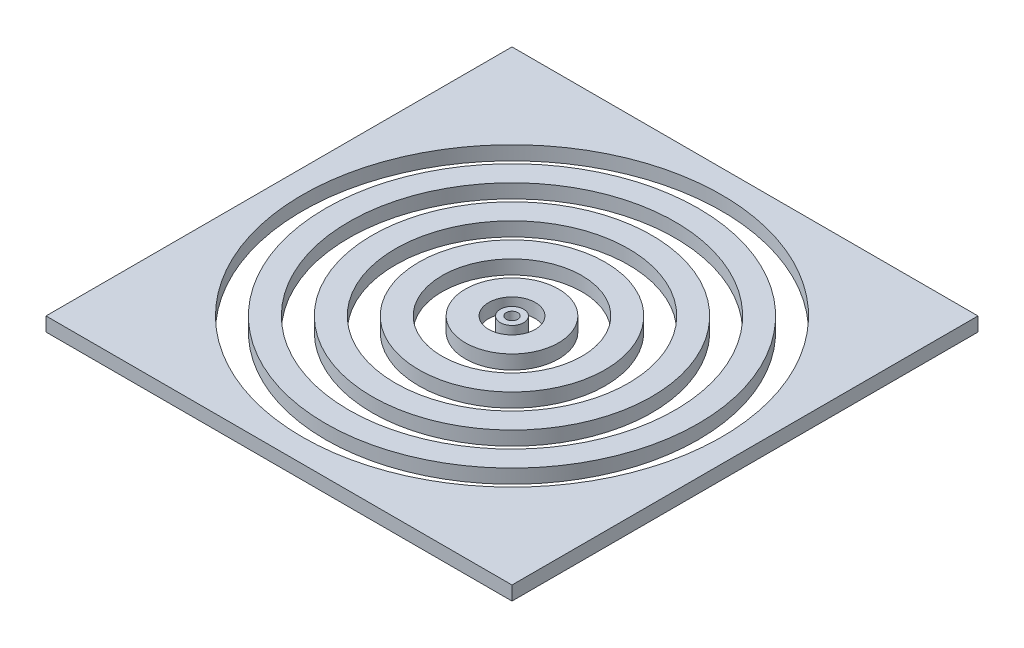
ISO-10303-21;
HEADER;
FILE_DESCRIPTION(('STEP AP214'),'2;1');
FILE_NAME('part.step','',(''),(''),'','','');
FILE_SCHEMA(('AUTOMOTIVE_DESIGN { 1 0 10303 214 1 1 1 1 }'));
ENDSEC;
DATA;
#1=APPLICATION_CONTEXT('core data for automotive mechanical design processes');
#2=APPLICATION_PROTOCOL_DEFINITION('international standard','automotive_design',2000,#1);
#3=PRODUCT_CONTEXT('',#1,'mechanical');
#4=PRODUCT('Part','Part','',(#3));
#5=PRODUCT_RELATED_PRODUCT_CATEGORY('part','',(#4));
#6=PRODUCT_DEFINITION_FORMATION('','',#4);
#7=PRODUCT_DEFINITION_CONTEXT('part definition',#1,'design');
#8=PRODUCT_DEFINITION('design','',#6,#7);
#9=PRODUCT_DEFINITION_SHAPE('','',#8);
#10=(LENGTH_UNIT() NAMED_UNIT(*) SI_UNIT(.MILLI.,.METRE.));
#11=(NAMED_UNIT(*) PLANE_ANGLE_UNIT() SI_UNIT($,.RADIAN.));
#12=(NAMED_UNIT(*) SI_UNIT($,.STERADIAN.) SOLID_ANGLE_UNIT());
#13=UNCERTAINTY_MEASURE_WITH_UNIT(LENGTH_MEASURE(1.E-05),#10,'distance_accuracy_value','');
#14=(GEOMETRIC_REPRESENTATION_CONTEXT(3) GLOBAL_UNCERTAINTY_ASSIGNED_CONTEXT((#13)) GLOBAL_UNIT_ASSIGNED_CONTEXT((#10,
#11,#12)) REPRESENTATION_CONTEXT('',''));
#15=CARTESIAN_POINT('',(0.,0.,0.));
#16=DIRECTION('',(0.,0.,1.));
#17=DIRECTION('',(1.,0.,0.));
#18=AXIS2_PLACEMENT_3D('',#15,#16,#17);
#19=CARTESIAN_POINT('',(50.,0.,-50.));
#20=DIRECTION('',(0.,1.,0.));
#21=DIRECTION('',(0.,0.,1.));
#22=AXIS2_PLACEMENT_3D('',#19,#20,#21);
#23=CYLINDRICAL_SURFACE('',#22,2.5);
#24=CARTESIAN_POINT('',(50.,0.,-50.));
#25=DIRECTION('',(0.,1.,0.));
#26=DIRECTION('',(0.,0.,1.));
#27=AXIS2_PLACEMENT_3D('',#24,#25,#26);
#28=CIRCLE('',#27,2.5);
#29=CARTESIAN_POINT('',(50.,0.,-47.5));
#30=VERTEX_POINT('',#29);
#31=EDGE_CURVE('E11',#30,#30,#28,.T.);
#32=ORIENTED_EDGE('',*,*,#31,.T.);
#33=EDGE_LOOP('',(#32));
#34=FACE_BOUND('',#33,.T.);
#35=CARTESIAN_POINT('',(50.,3.,-50.));
#36=DIRECTION('',(0.,1.,0.));
#37=DIRECTION('',(0.,0.,1.));
#38=AXIS2_PLACEMENT_3D('',#35,#36,#37);
#39=CIRCLE('',#38,2.5);
#40=CARTESIAN_POINT('',(50.,3.,-47.5));
#41=VERTEX_POINT('',#40);
#42=EDGE_CURVE('E42',#41,#41,#39,.T.);
#43=ORIENTED_EDGE('',*,*,#42,.F.);
#44=EDGE_LOOP('',(#43));
#45=FACE_BOUND('',#44,.T.);
#46=ADVANCED_FACE('F39',(#34,#45),#23,.T.);
#47=CARTESIAN_POINT('',(50.,0.,-50.));
#48=DIRECTION('',(0.,1.,0.));
#49=DIRECTION('',(0.,0.,1.));
#50=AXIS2_PLACEMENT_3D('',#47,#48,#49);
#51=PLANE('',#50);
#52=CARTESIAN_POINT('',(50.,0.,-50.));
#53=DIRECTION('',(0.,1.,0.));
#54=DIRECTION('',(0.,0.,1.));
#55=AXIS2_PLACEMENT_3D('',#52,#53,#54);
#56=CIRCLE('',#55,1.25);
#57=CARTESIAN_POINT('',(50.,0.,-48.75));
#58=VERTEX_POINT('',#57);
#59=EDGE_CURVE('E49',#58,#58,#56,.T.);
#60=ORIENTED_EDGE('',*,*,#59,.T.);
#61=EDGE_LOOP('',(#60));
#62=FACE_BOUND('',#61,.T.);
#63=ORIENTED_EDGE('',*,*,#31,.F.);
#64=EDGE_LOOP('',(#63));
#65=FACE_BOUND('',#64,.T.);
#66=ADVANCED_FACE('F57',(#62,#65),#51,.F.);
#67=CARTESIAN_POINT('',(50.,3.,-50.));
#68=DIRECTION('',(0.,1.,0.));
#69=DIRECTION('',(0.,0.,1.));
#70=AXIS2_PLACEMENT_3D('',#67,#68,#69);
#71=PLANE('',#70);
#72=CARTESIAN_POINT('',(50.,3.,-50.));
#73=DIRECTION('',(0.,1.,0.));
#74=DIRECTION('',(0.,0.,1.));
#75=AXIS2_PLACEMENT_3D('',#72,#73,#74);
#76=CIRCLE('',#75,1.25);
#77=CARTESIAN_POINT('',(50.,3.,-48.75));
#78=VERTEX_POINT('',#77);
#79=EDGE_CURVE('E51',#78,#78,#76,.T.);
#80=ORIENTED_EDGE('',*,*,#79,.F.);
#81=EDGE_LOOP('',(#80));
#82=FACE_BOUND('',#81,.T.);
#83=ORIENTED_EDGE('',*,*,#42,.T.);
#84=EDGE_LOOP('',(#83));
#85=FACE_BOUND('',#84,.T.);
#86=ADVANCED_FACE('F63',(#82,#85),#71,.T.);
#87=CARTESIAN_POINT('',(50.,0.,-50.));
#88=DIRECTION('',(0.,1.,0.));
#89=DIRECTION('',(0.,0.,1.));
#90=AXIS2_PLACEMENT_3D('',#87,#88,#89);
#91=CYLINDRICAL_SURFACE('',#90,1.25);
#92=ORIENTED_EDGE('',*,*,#59,.F.);
#93=EDGE_LOOP('',(#92));
#94=FACE_BOUND('',#93,.T.);
#95=ORIENTED_EDGE('',*,*,#79,.T.);
#96=EDGE_LOOP('',(#95));
#97=FACE_BOUND('',#96,.T.);
#98=ADVANCED_FACE('F60',(#94,#97),#91,.F.);
#99=CLOSED_SHELL('',(#46,#66,#86,#98));
#100=MANIFOLD_SOLID_BREP('B2',#99);
#101=CARTESIAN_POINT('',(50.,0.,-50.));
#102=DIRECTION('',(0.,1.,0.));
#103=DIRECTION('',(0.,0.,1.));
#104=AXIS2_PLACEMENT_3D('',#101,#102,#103);
#105=CYLINDRICAL_SURFACE('',#104,10.);
#106=CARTESIAN_POINT('',(50.,0.,-50.));
#107=DIRECTION('',(0.,1.,0.));
#108=DIRECTION('',(0.,0.,1.));
#109=AXIS2_PLACEMENT_3D('',#106,#107,#108);
#110=CIRCLE('',#109,10.);
#111=CARTESIAN_POINT('',(50.,0.,-40.));
#112=VERTEX_POINT('',#111);
#113=EDGE_CURVE('E38',#112,#112,#110,.T.);
#114=ORIENTED_EDGE('',*,*,#113,.T.);
#115=EDGE_LOOP('',(#114));
#116=FACE_BOUND('',#115,.T.);
#117=CARTESIAN_POINT('',(50.,3.,-50.));
#118=DIRECTION('',(0.,1.,0.));
#119=DIRECTION('',(0.,0.,1.));
#120=AXIS2_PLACEMENT_3D('',#117,#118,#119);
#121=CIRCLE('',#120,10.);
#122=CARTESIAN_POINT('',(50.,3.,-40.));
#123=VERTEX_POINT('',#122);
#124=EDGE_CURVE('E111',#123,#123,#121,.T.);
#125=ORIENTED_EDGE('',*,*,#124,.F.);
#126=EDGE_LOOP('',(#125));
#127=FACE_BOUND('',#126,.T.);
#128=ADVANCED_FACE('F108',(#116,#127),#105,.T.);
#129=CARTESIAN_POINT('',(50.,0.,-50.));
#130=DIRECTION('',(0.,1.,0.));
#131=DIRECTION('',(0.,0.,1.));
#132=AXIS2_PLACEMENT_3D('',#129,#130,#131);
#133=PLANE('',#132);
#134=CARTESIAN_POINT('',(50.,0.,-50.));
#135=DIRECTION('',(0.,1.,0.));
#136=DIRECTION('',(0.,0.,1.));
#137=AXIS2_PLACEMENT_3D('',#134,#135,#136);
#138=CIRCLE('',#137,5.);
#139=CARTESIAN_POINT('',(50.,0.,-45.));
#140=VERTEX_POINT('',#139);
#141=EDGE_CURVE('E118',#140,#140,#138,.T.);
#142=ORIENTED_EDGE('',*,*,#141,.T.);
#143=EDGE_LOOP('',(#142));
#144=FACE_BOUND('',#143,.T.);
#145=ORIENTED_EDGE('',*,*,#113,.F.);
#146=EDGE_LOOP('',(#145));
#147=FACE_BOUND('',#146,.T.);
#148=ADVANCED_FACE('F126',(#144,#147),#133,.F.);
#149=CARTESIAN_POINT('',(50.,3.,-50.));
#150=DIRECTION('',(0.,1.,0.));
#151=DIRECTION('',(0.,0.,1.));
#152=AXIS2_PLACEMENT_3D('',#149,#150,#151);
#153=PLANE('',#152);
#154=CARTESIAN_POINT('',(50.,3.,-50.));
#155=DIRECTION('',(0.,1.,0.));
#156=DIRECTION('',(0.,0.,1.));
#157=AXIS2_PLACEMENT_3D('',#154,#155,#156);
#158=CIRCLE('',#157,5.);
#159=CARTESIAN_POINT('',(50.,3.,-45.));
#160=VERTEX_POINT('',#159);
#161=EDGE_CURVE('E120',#160,#160,#158,.T.);
#162=ORIENTED_EDGE('',*,*,#161,.F.);
#163=EDGE_LOOP('',(#162));
#164=FACE_BOUND('',#163,.T.);
#165=ORIENTED_EDGE('',*,*,#124,.T.);
#166=EDGE_LOOP('',(#165));
#167=FACE_BOUND('',#166,.T.);
#168=ADVANCED_FACE('F132',(#164,#167),#153,.T.);
#169=CARTESIAN_POINT('',(50.,0.,-50.));
#170=DIRECTION('',(0.,1.,0.));
#171=DIRECTION('',(0.,0.,1.));
#172=AXIS2_PLACEMENT_3D('',#169,#170,#171);
#173=CYLINDRICAL_SURFACE('',#172,5.);
#174=ORIENTED_EDGE('',*,*,#141,.F.);
#175=EDGE_LOOP('',(#174));
#176=FACE_BOUND('',#175,.T.);
#177=ORIENTED_EDGE('',*,*,#161,.T.);
#178=EDGE_LOOP('',(#177));
#179=FACE_BOUND('',#178,.T.);
#180=ADVANCED_FACE('F129',(#176,#179),#173,.F.);
#181=CLOSED_SHELL('',(#128,#148,#168,#180));
#182=MANIFOLD_SOLID_BREP('B6',#181);
#183=CARTESIAN_POINT('',(50.,0.,-50.));
#184=DIRECTION('',(0.,1.,0.));
#185=DIRECTION('',(0.,0.,1.));
#186=AXIS2_PLACEMENT_3D('',#183,#184,#185);
#187=CYLINDRICAL_SURFACE('',#186,20.);
#188=CARTESIAN_POINT('',(50.,0.,-50.));
#189=DIRECTION('',(0.,1.,0.));
#190=DIRECTION('',(0.,0.,1.));
#191=AXIS2_PLACEMENT_3D('',#188,#189,#190);
#192=CIRCLE('',#191,20.);
#193=CARTESIAN_POINT('',(50.,0.,-30.));
#194=VERTEX_POINT('',#193);
#195=EDGE_CURVE('E107',#194,#194,#192,.T.);
#196=ORIENTED_EDGE('',*,*,#195,.T.);
#197=EDGE_LOOP('',(#196));
#198=FACE_BOUND('',#197,.T.);
#199=CARTESIAN_POINT('',(50.,3.,-50.));
#200=DIRECTION('',(0.,1.,0.));
#201=DIRECTION('',(0.,0.,1.));
#202=AXIS2_PLACEMENT_3D('',#199,#200,#201);
#203=CIRCLE('',#202,20.);
#204=CARTESIAN_POINT('',(50.,3.,-30.));
#205=VERTEX_POINT('',#204);
#206=EDGE_CURVE('E180',#205,#205,#203,.T.);
#207=ORIENTED_EDGE('',*,*,#206,.F.);
#208=EDGE_LOOP('',(#207));
#209=FACE_BOUND('',#208,.T.);
#210=ADVANCED_FACE('F177',(#198,#209),#187,.T.);
#211=CARTESIAN_POINT('',(50.,0.,-50.));
#212=DIRECTION('',(0.,1.,0.));
#213=DIRECTION('',(0.,0.,1.));
#214=AXIS2_PLACEMENT_3D('',#211,#212,#213);
#215=PLANE('',#214);
#216=CARTESIAN_POINT('',(50.,0.,-50.));
#217=DIRECTION('',(0.,1.,0.));
#218=DIRECTION('',(0.,0.,1.));
#219=AXIS2_PLACEMENT_3D('',#216,#217,#218);
#220=CIRCLE('',#219,15.);
#221=CARTESIAN_POINT('',(50.,0.,-35.));
#222=VERTEX_POINT('',#221);
#223=EDGE_CURVE('E187',#222,#222,#220,.T.);
#224=ORIENTED_EDGE('',*,*,#223,.T.);
#225=EDGE_LOOP('',(#224));
#226=FACE_BOUND('',#225,.T.);
#227=ORIENTED_EDGE('',*,*,#195,.F.);
#228=EDGE_LOOP('',(#227));
#229=FACE_BOUND('',#228,.T.);
#230=ADVANCED_FACE('F195',(#226,#229),#215,.F.);
#231=CARTESIAN_POINT('',(50.,3.,-50.));
#232=DIRECTION('',(0.,1.,0.));
#233=DIRECTION('',(0.,0.,1.));
#234=AXIS2_PLACEMENT_3D('',#231,#232,#233);
#235=PLANE('',#234);
#236=CARTESIAN_POINT('',(50.,3.,-50.));
#237=DIRECTION('',(0.,1.,0.));
#238=DIRECTION('',(0.,0.,1.));
#239=AXIS2_PLACEMENT_3D('',#236,#237,#238);
#240=CIRCLE('',#239,15.);
#241=CARTESIAN_POINT('',(50.,3.,-35.));
#242=VERTEX_POINT('',#241);
#243=EDGE_CURVE('E189',#242,#242,#240,.T.);
#244=ORIENTED_EDGE('',*,*,#243,.F.);
#245=EDGE_LOOP('',(#244));
#246=FACE_BOUND('',#245,.T.);
#247=ORIENTED_EDGE('',*,*,#206,.T.);
#248=EDGE_LOOP('',(#247));
#249=FACE_BOUND('',#248,.T.);
#250=ADVANCED_FACE('F201',(#246,#249),#235,.T.);
#251=CARTESIAN_POINT('',(50.,0.,-50.));
#252=DIRECTION('',(0.,1.,0.));
#253=DIRECTION('',(0.,0.,1.));
#254=AXIS2_PLACEMENT_3D('',#251,#252,#253);
#255=CYLINDRICAL_SURFACE('',#254,15.);
#256=ORIENTED_EDGE('',*,*,#223,.F.);
#257=EDGE_LOOP('',(#256));
#258=FACE_BOUND('',#257,.T.);
#259=ORIENTED_EDGE('',*,*,#243,.T.);
#260=EDGE_LOOP('',(#259));
#261=FACE_BOUND('',#260,.T.);
#262=ADVANCED_FACE('F198',(#258,#261),#255,.F.);
#263=CLOSED_SHELL('',(#210,#230,#250,#262));
#264=MANIFOLD_SOLID_BREP('B33',#263);
#265=CARTESIAN_POINT('',(50.,0.,-50.));
#266=DIRECTION('',(0.,1.,0.));
#267=DIRECTION('',(0.,0.,1.));
#268=AXIS2_PLACEMENT_3D('',#265,#266,#267);
#269=CYLINDRICAL_SURFACE('',#268,30.);
#270=CARTESIAN_POINT('',(50.,0.,-50.));
#271=DIRECTION('',(0.,1.,0.));
#272=DIRECTION('',(0.,0.,1.));
#273=AXIS2_PLACEMENT_3D('',#270,#271,#272);
#274=CIRCLE('',#273,30.);
#275=CARTESIAN_POINT('',(50.,0.,-20.));
#276=VERTEX_POINT('',#275);
#277=EDGE_CURVE('E176',#276,#276,#274,.T.);
#278=ORIENTED_EDGE('',*,*,#277,.T.);
#279=EDGE_LOOP('',(#278));
#280=FACE_BOUND('',#279,.T.);
#281=CARTESIAN_POINT('',(50.,3.,-50.));
#282=DIRECTION('',(0.,1.,0.));
#283=DIRECTION('',(0.,0.,1.));
#284=AXIS2_PLACEMENT_3D('',#281,#282,#283);
#285=CIRCLE('',#284,30.);
#286=CARTESIAN_POINT('',(50.,3.,-20.));
#287=VERTEX_POINT('',#286);
#288=EDGE_CURVE('E249',#287,#287,#285,.T.);
#289=ORIENTED_EDGE('',*,*,#288,.F.);
#290=EDGE_LOOP('',(#289));
#291=FACE_BOUND('',#290,.T.);
#292=ADVANCED_FACE('F246',(#280,#291),#269,.T.);
#293=CARTESIAN_POINT('',(50.,0.,-50.));
#294=DIRECTION('',(0.,1.,0.));
#295=DIRECTION('',(0.,0.,1.));
#296=AXIS2_PLACEMENT_3D('',#293,#294,#295);
#297=PLANE('',#296);
#298=CARTESIAN_POINT('',(50.,0.,-50.));
#299=DIRECTION('',(0.,1.,0.));
#300=DIRECTION('',(0.,0.,1.));
#301=AXIS2_PLACEMENT_3D('',#298,#299,#300);
#302=CIRCLE('',#301,25.);
#303=CARTESIAN_POINT('',(50.,0.,-25.));
#304=VERTEX_POINT('',#303);
#305=EDGE_CURVE('E256',#304,#304,#302,.T.);
#306=ORIENTED_EDGE('',*,*,#305,.T.);
#307=EDGE_LOOP('',(#306));
#308=FACE_BOUND('',#307,.T.);
#309=ORIENTED_EDGE('',*,*,#277,.F.);
#310=EDGE_LOOP('',(#309));
#311=FACE_BOUND('',#310,.T.);
#312=ADVANCED_FACE('F264',(#308,#311),#297,.F.);
#313=CARTESIAN_POINT('',(50.,3.,-50.));
#314=DIRECTION('',(0.,1.,0.));
#315=DIRECTION('',(0.,0.,1.));
#316=AXIS2_PLACEMENT_3D('',#313,#314,#315);
#317=PLANE('',#316);
#318=CARTESIAN_POINT('',(50.,3.,-50.));
#319=DIRECTION('',(0.,1.,0.));
#320=DIRECTION('',(0.,0.,1.));
#321=AXIS2_PLACEMENT_3D('',#318,#319,#320);
#322=CIRCLE('',#321,25.);
#323=CARTESIAN_POINT('',(50.,3.,-25.));
#324=VERTEX_POINT('',#323);
#325=EDGE_CURVE('E258',#324,#324,#322,.T.);
#326=ORIENTED_EDGE('',*,*,#325,.F.);
#327=EDGE_LOOP('',(#326));
#328=FACE_BOUND('',#327,.T.);
#329=ORIENTED_EDGE('',*,*,#288,.T.);
#330=EDGE_LOOP('',(#329));
#331=FACE_BOUND('',#330,.T.);
#332=ADVANCED_FACE('F270',(#328,#331),#317,.T.);
#333=CARTESIAN_POINT('',(50.,0.,-50.));
#334=DIRECTION('',(0.,1.,0.));
#335=DIRECTION('',(0.,0.,1.));
#336=AXIS2_PLACEMENT_3D('',#333,#334,#335);
#337=CYLINDRICAL_SURFACE('',#336,25.);
#338=ORIENTED_EDGE('',*,*,#305,.F.);
#339=EDGE_LOOP('',(#338));
#340=FACE_BOUND('',#339,.T.);
#341=ORIENTED_EDGE('',*,*,#325,.T.);
#342=EDGE_LOOP('',(#341));
#343=FACE_BOUND('',#342,.T.);
#344=ADVANCED_FACE('F267',(#340,#343),#337,.F.);
#345=CLOSED_SHELL('',(#292,#312,#332,#344));
#346=MANIFOLD_SOLID_BREP('B102',#345);
#347=CARTESIAN_POINT('',(50.,0.,-50.));
#348=DIRECTION('',(0.,1.,0.));
#349=DIRECTION('',(0.,0.,1.));
#350=AXIS2_PLACEMENT_3D('',#347,#348,#349);
#351=CYLINDRICAL_SURFACE('',#350,40.);
#352=CARTESIAN_POINT('',(50.,0.,-50.));
#353=DIRECTION('',(0.,1.,0.));
#354=DIRECTION('',(0.,0.,1.));
#355=AXIS2_PLACEMENT_3D('',#352,#353,#354);
#356=CIRCLE('',#355,40.);
#357=CARTESIAN_POINT('',(50.,0.,-10.));
#358=VERTEX_POINT('',#357);
#359=EDGE_CURVE('E245',#358,#358,#356,.T.);
#360=ORIENTED_EDGE('',*,*,#359,.T.);
#361=EDGE_LOOP('',(#360));
#362=FACE_BOUND('',#361,.T.);
#363=CARTESIAN_POINT('',(50.,3.,-50.));
#364=DIRECTION('',(0.,1.,0.));
#365=DIRECTION('',(0.,0.,1.));
#366=AXIS2_PLACEMENT_3D('',#363,#364,#365);
#367=CIRCLE('',#366,40.);
#368=CARTESIAN_POINT('',(50.,3.,-10.));
#369=VERTEX_POINT('',#368);
#370=EDGE_CURVE('E319',#369,#369,#367,.T.);
#371=ORIENTED_EDGE('',*,*,#370,.F.);
#372=EDGE_LOOP('',(#371));
#373=FACE_BOUND('',#372,.T.);
#374=ADVANCED_FACE('F316',(#362,#373),#351,.T.);
#375=CARTESIAN_POINT('',(50.,0.,-50.));
#376=DIRECTION('',(0.,1.,0.));
#377=DIRECTION('',(0.,0.,1.));
#378=AXIS2_PLACEMENT_3D('',#375,#376,#377);
#379=PLANE('',#378);
#380=CARTESIAN_POINT('',(50.,0.,-50.));
#381=DIRECTION('',(0.,1.,0.));
#382=DIRECTION('',(0.,0.,1.));
#383=AXIS2_PLACEMENT_3D('',#380,#381,#382);
#384=CIRCLE('',#383,35.);
#385=CARTESIAN_POINT('',(50.,0.,-15.));
#386=VERTEX_POINT('',#385);
#387=EDGE_CURVE('E326',#386,#386,#384,.T.);
#388=ORIENTED_EDGE('',*,*,#387,.T.);
#389=EDGE_LOOP('',(#388));
#390=FACE_BOUND('',#389,.T.);
#391=ORIENTED_EDGE('',*,*,#359,.F.);
#392=EDGE_LOOP('',(#391));
#393=FACE_BOUND('',#392,.T.);
#394=ADVANCED_FACE('F334',(#390,#393),#379,.F.);
#395=CARTESIAN_POINT('',(50.,3.,-50.));
#396=DIRECTION('',(0.,1.,0.));
#397=DIRECTION('',(0.,0.,1.));
#398=AXIS2_PLACEMENT_3D('',#395,#396,#397);
#399=PLANE('',#398);
#400=CARTESIAN_POINT('',(50.,3.,-50.));
#401=DIRECTION('',(0.,1.,0.));
#402=DIRECTION('',(0.,0.,1.));
#403=AXIS2_PLACEMENT_3D('',#400,#401,#402);
#404=CIRCLE('',#403,35.);
#405=CARTESIAN_POINT('',(50.,3.,-15.));
#406=VERTEX_POINT('',#405);
#407=EDGE_CURVE('E328',#406,#406,#404,.T.);
#408=ORIENTED_EDGE('',*,*,#407,.F.);
#409=EDGE_LOOP('',(#408));
#410=FACE_BOUND('',#409,.T.);
#411=ORIENTED_EDGE('',*,*,#370,.T.);
#412=EDGE_LOOP('',(#411));
#413=FACE_BOUND('',#412,.T.);
#414=ADVANCED_FACE('F340',(#410,#413),#399,.T.);
#415=CARTESIAN_POINT('',(50.,0.,-50.));
#416=DIRECTION('',(0.,1.,0.));
#417=DIRECTION('',(0.,0.,1.));
#418=AXIS2_PLACEMENT_3D('',#415,#416,#417);
#419=CYLINDRICAL_SURFACE('',#418,35.);
#420=ORIENTED_EDGE('',*,*,#387,.F.);
#421=EDGE_LOOP('',(#420));
#422=FACE_BOUND('',#421,.T.);
#423=ORIENTED_EDGE('',*,*,#407,.T.);
#424=EDGE_LOOP('',(#423));
#425=FACE_BOUND('',#424,.T.);
#426=ADVANCED_FACE('F337',(#422,#425),#419,.F.);
#427=CLOSED_SHELL('',(#374,#394,#414,#426));
#428=MANIFOLD_SOLID_BREP('B171',#427);
#429=CARTESIAN_POINT('',(0.,3.,0.));
#430=DIRECTION('',(1.,0.,0.));
#431=DIRECTION('',(0.,0.,-1.));
#432=AXIS2_PLACEMENT_3D('',#429,#430,#431);
#433=PLANE('',#432);
#434=DIRECTION('',(0.,0.,1.));
#435=VECTOR('',#434,1.);
#436=CARTESIAN_POINT('',(0.,0.,0.));
#437=LINE('',#436,#435);
#438=CARTESIAN_POINT('',(0.,0.,-100.));
#439=VERTEX_POINT('',#438);
#440=CARTESIAN_POINT('',(0.,0.,0.));
#441=VERTEX_POINT('',#440);
#442=EDGE_CURVE('E440',#439,#441,#437,.T.);
#443=ORIENTED_EDGE('',*,*,#442,.T.);
#444=DIRECTION('',(0.,-1.,0.));
#445=VECTOR('',#444,1.);
#446=CARTESIAN_POINT('',(0.,3.,0.));
#447=LINE('',#446,#445);
#448=CARTESIAN_POINT('',(0.,3.,0.));
#449=VERTEX_POINT('',#448);
#450=EDGE_CURVE('E314',#449,#441,#447,.T.);
#451=ORIENTED_EDGE('',*,*,#450,.F.);
#452=DIRECTION('',(0.,0.,1.));
#453=VECTOR('',#452,1.);
#454=CARTESIAN_POINT('',(0.,3.,0.));
#455=LINE('',#454,#453);
#456=CARTESIAN_POINT('',(0.,3.,-100.));
#457=VERTEX_POINT('',#456);
#458=EDGE_CURVE('E428',#457,#449,#455,.T.);
#459=ORIENTED_EDGE('',*,*,#458,.F.);
#460=DIRECTION('',(0.,-1.,0.));
#461=VECTOR('',#460,1.);
#462=CARTESIAN_POINT('',(0.,3.,-100.));
#463=LINE('',#462,#461);
#464=EDGE_CURVE('E436',#457,#439,#463,.T.);
#465=ORIENTED_EDGE('',*,*,#464,.T.);
#466=EDGE_LOOP('',(#443,#451,#459,#465));
#467=FACE_BOUND('',#466,.T.);
#468=ADVANCED_FACE('F377',(#467),#433,.F.);
#469=CARTESIAN_POINT('',(0.,3.,0.));
#470=DIRECTION('',(0.,0.,-1.));
#471=DIRECTION('',(-1.,0.,0.));
#472=AXIS2_PLACEMENT_3D('',#469,#470,#471);
#473=PLANE('',#472);
#474=DIRECTION('',(1.,0.,0.));
#475=VECTOR('',#474,1.);
#476=CARTESIAN_POINT('',(0.,0.,0.));
#477=LINE('',#476,#475);
#478=CARTESIAN_POINT('',(100.,0.,0.));
#479=VERTEX_POINT('',#478);
#480=EDGE_CURVE('E432',#441,#479,#477,.T.);
#481=ORIENTED_EDGE('',*,*,#480,.T.);
#482=DIRECTION('',(0.,-1.,0.));
#483=VECTOR('',#482,1.);
#484=CARTESIAN_POINT('',(100.,3.,0.));
#485=LINE('',#484,#483);
#486=CARTESIAN_POINT('',(100.,3.,0.));
#487=VERTEX_POINT('',#486);
#488=EDGE_CURVE('E385',#487,#479,#485,.T.);
#489=ORIENTED_EDGE('',*,*,#488,.F.);
#490=DIRECTION('',(1.,0.,0.));
#491=VECTOR('',#490,1.);
#492=CARTESIAN_POINT('',(0.,3.,0.));
#493=LINE('',#492,#491);
#494=EDGE_CURVE('E423',#449,#487,#493,.T.);
#495=ORIENTED_EDGE('',*,*,#494,.F.);
#496=ORIENTED_EDGE('',*,*,#450,.T.);
#497=EDGE_LOOP('',(#481,#489,#495,#496));
#498=FACE_BOUND('',#497,.T.);
#499=ADVANCED_FACE('F431',(#498),#473,.F.);
#500=CARTESIAN_POINT('',(100.,3.,0.));
#501=DIRECTION('',(-1.,0.,0.));
#502=DIRECTION('',(0.,0.,1.));
#503=AXIS2_PLACEMENT_3D('',#500,#501,#502);
#504=PLANE('',#503);
#505=DIRECTION('',(0.,0.,-1.));
#506=VECTOR('',#505,1.);
#507=CARTESIAN_POINT('',(100.,0.,0.));
#508=LINE('',#507,#506);
#509=CARTESIAN_POINT('',(100.,0.,-100.));
#510=VERTEX_POINT('',#509);
#511=EDGE_CURVE('E410',#479,#510,#508,.T.);
#512=ORIENTED_EDGE('',*,*,#511,.T.);
#513=DIRECTION('',(0.,-1.,0.));
#514=VECTOR('',#513,1.);
#515=CARTESIAN_POINT('',(100.,3.,-100.));
#516=LINE('',#515,#514);
#517=CARTESIAN_POINT('',(100.,3.,-100.));
#518=VERTEX_POINT('',#517);
#519=EDGE_CURVE('E433',#518,#510,#516,.T.);
#520=ORIENTED_EDGE('',*,*,#519,.F.);
#521=DIRECTION('',(0.,0.,-1.));
#522=VECTOR('',#521,1.);
#523=CARTESIAN_POINT('',(100.,3.,0.));
#524=LINE('',#523,#522);
#525=EDGE_CURVE('E426',#487,#518,#524,.T.);
#526=ORIENTED_EDGE('',*,*,#525,.F.);
#527=ORIENTED_EDGE('',*,*,#488,.T.);
#528=EDGE_LOOP('',(#512,#520,#526,#527));
#529=FACE_BOUND('',#528,.T.);
#530=ADVANCED_FACE('F434',(#529),#504,.F.);
#531=CARTESIAN_POINT('',(0.,3.,-100.));
#532=DIRECTION('',(0.,0.,1.));
#533=DIRECTION('',(1.,0.,0.));
#534=AXIS2_PLACEMENT_3D('',#531,#532,#533);
#535=PLANE('',#534);
#536=DIRECTION('',(-1.,0.,0.));
#537=VECTOR('',#536,1.);
#538=CARTESIAN_POINT('',(0.,0.,-100.));
#539=LINE('',#538,#537);
#540=EDGE_CURVE('E416',#510,#439,#539,.T.);
#541=ORIENTED_EDGE('',*,*,#540,.T.);
#542=ORIENTED_EDGE('',*,*,#464,.F.);
#543=DIRECTION('',(-1.,0.,0.));
#544=VECTOR('',#543,1.);
#545=CARTESIAN_POINT('',(0.,3.,-100.));
#546=LINE('',#545,#544);
#547=EDGE_CURVE('E393',#518,#457,#546,.T.);
#548=ORIENTED_EDGE('',*,*,#547,.F.);
#549=ORIENTED_EDGE('',*,*,#519,.T.);
#550=EDGE_LOOP('',(#541,#542,#548,#549));
#551=FACE_BOUND('',#550,.T.);
#552=ADVANCED_FACE('F448',(#551),#535,.F.);
#553=CARTESIAN_POINT('',(0.,3.,0.));
#554=DIRECTION('',(0.,-1.,0.));
#555=DIRECTION('',(0.,0.,-1.));
#556=AXIS2_PLACEMENT_3D('',#553,#554,#555);
#557=PLANE('',#556);
#558=CARTESIAN_POINT('',(50.,3.,-50.));
#559=DIRECTION('',(0.,1.,0.));
#560=DIRECTION('',(0.,0.,1.));
#561=AXIS2_PLACEMENT_3D('',#558,#559,#560);
#562=CIRCLE('',#561,45.);
#563=CARTESIAN_POINT('',(50.,3.,-5.));
#564=VERTEX_POINT('',#563);
#565=EDGE_CURVE('E454',#564,#564,#562,.T.);
#566=ORIENTED_EDGE('',*,*,#565,.F.);
#567=EDGE_LOOP('',(#566));
#568=FACE_BOUND('',#567,.T.);
#569=ORIENTED_EDGE('',*,*,#458,.T.);
#570=ORIENTED_EDGE('',*,*,#494,.T.);
#571=ORIENTED_EDGE('',*,*,#525,.T.);
#572=ORIENTED_EDGE('',*,*,#547,.T.);
#573=EDGE_LOOP('',(#569,#570,#571,#572));
#574=FACE_BOUND('',#573,.T.);
#575=ADVANCED_FACE('F424',(#568,#574),#557,.F.);
#576=CARTESIAN_POINT('',(0.,0.,0.));
#577=DIRECTION('',(0.,-1.,0.));
#578=DIRECTION('',(0.,0.,-1.));
#579=AXIS2_PLACEMENT_3D('',#576,#577,#578);
#580=PLANE('',#579);
#581=CARTESIAN_POINT('',(50.,0.,-50.));
#582=DIRECTION('',(0.,1.,0.));
#583=DIRECTION('',(0.,0.,1.));
#584=AXIS2_PLACEMENT_3D('',#581,#582,#583);
#585=CIRCLE('',#584,45.);
#586=CARTESIAN_POINT('',(50.,0.,-5.));
#587=VERTEX_POINT('',#586);
#588=EDGE_CURVE('E443',#587,#587,#585,.T.);
#589=ORIENTED_EDGE('',*,*,#588,.T.);
#590=EDGE_LOOP('',(#589));
#591=FACE_BOUND('',#590,.T.);
#592=ORIENTED_EDGE('',*,*,#442,.F.);
#593=ORIENTED_EDGE('',*,*,#540,.F.);
#594=ORIENTED_EDGE('',*,*,#511,.F.);
#595=ORIENTED_EDGE('',*,*,#480,.F.);
#596=EDGE_LOOP('',(#592,#593,#594,#595));
#597=FACE_BOUND('',#596,.T.);
#598=ADVANCED_FACE('F451',(#591,#597),#580,.T.);
#599=CARTESIAN_POINT('',(50.,0.,-50.));
#600=DIRECTION('',(0.,1.,0.));
#601=DIRECTION('',(0.,0.,1.));
#602=AXIS2_PLACEMENT_3D('',#599,#600,#601);
#603=CYLINDRICAL_SURFACE('',#602,45.);
#604=ORIENTED_EDGE('',*,*,#588,.F.);
#605=EDGE_LOOP('',(#604));
#606=FACE_BOUND('',#605,.T.);
#607=ORIENTED_EDGE('',*,*,#565,.T.);
#608=EDGE_LOOP('',(#607));
#609=FACE_BOUND('',#608,.T.);
#610=ADVANCED_FACE('F461',(#606,#609),#603,.F.);
#611=CLOSED_SHELL('',(#468,#499,#530,#552,#575,#598,#610));
#612=MANIFOLD_SOLID_BREP('B240',#611);
#613=ADVANCED_BREP_SHAPE_REPRESENTATION('',(#18,#100,#182,#264,#346,#428,#612),#14);
#614=SHAPE_DEFINITION_REPRESENTATION(#9,#613);
ENDSEC;
END-ISO-10303-21;
